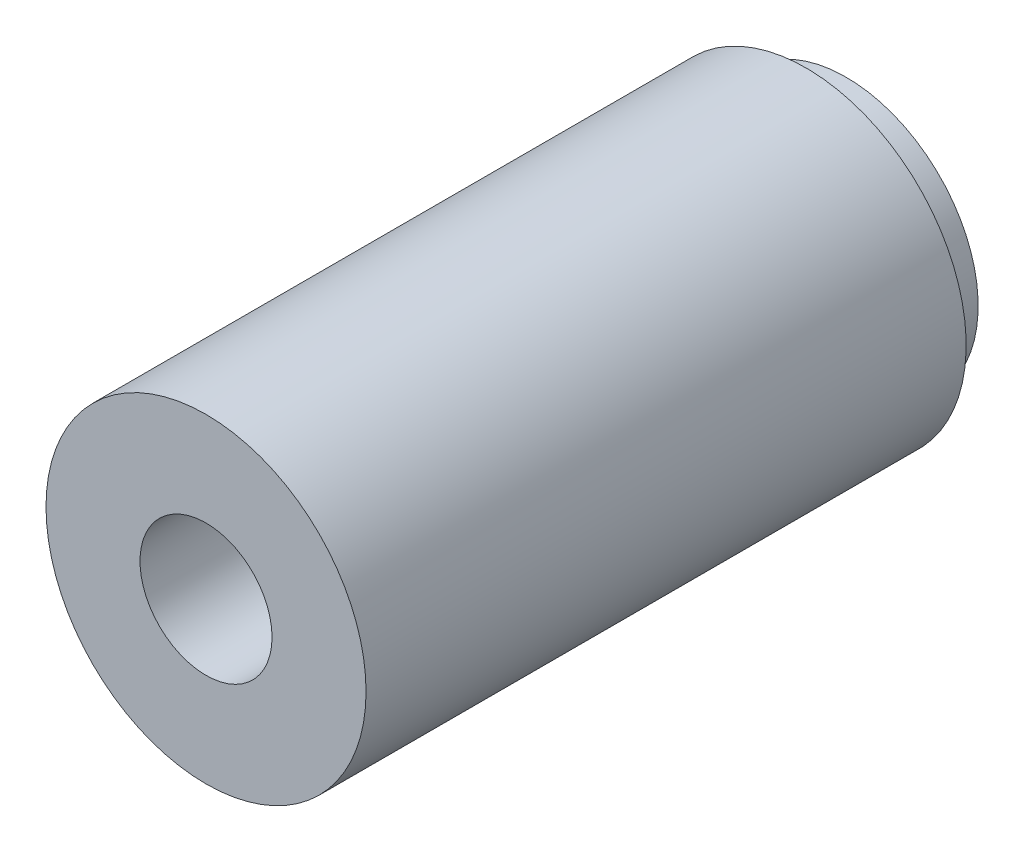
ISO-10303-21;
HEADER;
FILE_DESCRIPTION(('STEP AP214'),'2;1');
FILE_NAME('part.step','',(''),(''),'','','');
FILE_SCHEMA(('AUTOMOTIVE_DESIGN { 1 0 10303 214 1 1 1 1 }'));
ENDSEC;
DATA;
#1=APPLICATION_CONTEXT('core data for automotive mechanical design processes');
#2=APPLICATION_PROTOCOL_DEFINITION('international standard','automotive_design',2000,#1);
#3=PRODUCT_CONTEXT('',#1,'mechanical');
#4=PRODUCT('Part','Part','',(#3));
#5=PRODUCT_RELATED_PRODUCT_CATEGORY('part','',(#4));
#6=PRODUCT_DEFINITION_FORMATION('','',#4);
#7=PRODUCT_DEFINITION_CONTEXT('part definition',#1,'design');
#8=PRODUCT_DEFINITION('design','',#6,#7);
#9=PRODUCT_DEFINITION_SHAPE('','',#8);
#10=(LENGTH_UNIT() NAMED_UNIT(*) SI_UNIT(.MILLI.,.METRE.));
#11=(NAMED_UNIT(*) PLANE_ANGLE_UNIT() SI_UNIT($,.RADIAN.));
#12=(NAMED_UNIT(*) SI_UNIT($,.STERADIAN.) SOLID_ANGLE_UNIT());
#13=UNCERTAINTY_MEASURE_WITH_UNIT(LENGTH_MEASURE(1.E-05),#10,'distance_accuracy_value','');
#14=(GEOMETRIC_REPRESENTATION_CONTEXT(3) GLOBAL_UNCERTAINTY_ASSIGNED_CONTEXT((#13)) GLOBAL_UNIT_ASSIGNED_CONTEXT((#10,
#11,#12)) REPRESENTATION_CONTEXT('',''));
#15=CARTESIAN_POINT('',(0.,0.,0.));
#16=DIRECTION('',(0.,0.,1.));
#17=DIRECTION('',(1.,0.,0.));
#18=AXIS2_PLACEMENT_3D('',#15,#16,#17);
#19=CARTESIAN_POINT('',(0.,0.,16.));
#20=DIRECTION('',(0.,0.,-1.));
#21=DIRECTION('',(-1.,0.,0.));
#22=AXIS2_PLACEMENT_3D('',#19,#20,#21);
#23=CYLINDRICAL_SURFACE('',#22,4.);
#24=CARTESIAN_POINT('',(0.,0.,16.));
#25=DIRECTION('',(0.,0.,1.));
#26=DIRECTION('',(1.,0.,0.));
#27=AXIS2_PLACEMENT_3D('',#24,#25,#26);
#28=CIRCLE('',#27,4.);
#29=CARTESIAN_POINT('',(4.,0.,16.));
#30=VERTEX_POINT('',#29);
#31=EDGE_CURVE('E11',#30,#30,#28,.T.);
#32=ORIENTED_EDGE('',*,*,#31,.F.);
#33=EDGE_LOOP('',(#32));
#34=FACE_BOUND('',#33,.T.);
#35=CARTESIAN_POINT('',(0.,0.,1.));
#36=DIRECTION('',(0.,0.,-1.));
#37=DIRECTION('',(-1.,0.,0.));
#38=AXIS2_PLACEMENT_3D('',#35,#36,#37);
#39=CIRCLE('',#38,4.);
#40=CARTESIAN_POINT('',(-4.,0.,1.));
#41=VERTEX_POINT('',#40);
#42=EDGE_CURVE('E41',#41,#41,#39,.T.);
#43=ORIENTED_EDGE('',*,*,#42,.F.);
#44=EDGE_LOOP('',(#43));
#45=FACE_BOUND('',#44,.T.);
#46=ADVANCED_FACE('F38',(#34,#45),#23,.T.);
#47=CARTESIAN_POINT('',(0.,0.,0.));
#48=DIRECTION('',(0.,0.,1.));
#49=DIRECTION('',(1.,0.,0.));
#50=AXIS2_PLACEMENT_3D('',#47,#48,#49);
#51=PLANE('',#50);
#52=CARTESIAN_POINT('',(0.,0.,0.));
#53=DIRECTION('',(0.,0.,-1.));
#54=DIRECTION('',(-1.,0.,0.));
#55=AXIS2_PLACEMENT_3D('',#52,#53,#54);
#56=CIRCLE('',#55,2.5);
#57=CARTESIAN_POINT('',(-2.5,0.,0.));
#58=VERTEX_POINT('',#57);
#59=EDGE_CURVE('E55',#58,#58,#56,.T.);
#60=ORIENTED_EDGE('',*,*,#59,.F.);
#61=EDGE_LOOP('',(#60));
#62=FACE_BOUND('',#61,.T.);
#63=CARTESIAN_POINT('',(0.,0.,0.));
#64=DIRECTION('',(0.,0.,-1.));
#65=DIRECTION('',(-1.,0.,0.));
#66=AXIS2_PLACEMENT_3D('',#63,#64,#65);
#67=CIRCLE('',#66,3.3);
#68=CARTESIAN_POINT('',(-3.3,0.,0.));
#69=VERTEX_POINT('',#68);
#70=EDGE_CURVE('E60',#69,#69,#67,.T.);
#71=ORIENTED_EDGE('',*,*,#70,.T.);
#72=EDGE_LOOP('',(#71));
#73=FACE_BOUND('',#72,.T.);
#74=ADVANCED_FACE('F73',(#62,#73),#51,.F.);
#75=CARTESIAN_POINT('',(0.,0.,16.));
#76=DIRECTION('',(0.,0.,1.));
#77=DIRECTION('',(1.,0.,0.));
#78=AXIS2_PLACEMENT_3D('',#75,#76,#77);
#79=PLANE('',#78);
#80=CARTESIAN_POINT('',(0.,0.,16.));
#81=DIRECTION('',(0.,0.,1.));
#82=DIRECTION('',(1.,0.,0.));
#83=AXIS2_PLACEMENT_3D('',#80,#81,#82);
#84=CIRCLE('',#83,1.64999999999999);
#85=CARTESIAN_POINT('',(1.64999999999999,0.,16.));
#86=VERTEX_POINT('',#85);
#87=EDGE_CURVE('E45',#86,#86,#84,.T.);
#88=ORIENTED_EDGE('',*,*,#87,.F.);
#89=EDGE_LOOP('',(#88));
#90=FACE_BOUND('',#89,.T.);
#91=ORIENTED_EDGE('',*,*,#31,.T.);
#92=EDGE_LOOP('',(#91));
#93=FACE_BOUND('',#92,.T.);
#94=ADVANCED_FACE('F78',(#90,#93),#79,.T.);
#95=CARTESIAN_POINT('',(0.,0.,16.));
#96=DIRECTION('',(0.,0.,1.));
#97=DIRECTION('',(1.,0.,0.));
#98=AXIS2_PLACEMENT_3D('',#95,#96,#97);
#99=CYLINDRICAL_SURFACE('',#98,1.64999999999999);
#100=CARTESIAN_POINT('',(0.,0.,8.));
#101=DIRECTION('',(0.,0.,-1.));
#102=DIRECTION('',(-1.,0.,0.));
#103=AXIS2_PLACEMENT_3D('',#100,#101,#102);
#104=CIRCLE('',#103,1.64999999999999);
#105=CARTESIAN_POINT('',(-1.64999999999999,0.,8.));
#106=VERTEX_POINT('',#105);
#107=EDGE_CURVE('E49',#106,#106,#104,.F.);
#108=ORIENTED_EDGE('',*,*,#107,.F.);
#109=EDGE_LOOP('',(#108));
#110=FACE_BOUND('',#109,.T.);
#111=ORIENTED_EDGE('',*,*,#87,.T.);
#112=EDGE_LOOP('',(#111));
#113=FACE_BOUND('',#112,.T.);
#114=ADVANCED_FACE('F83',(#110,#113),#99,.F.);
#115=CARTESIAN_POINT('',(0.,0.,8.));
#116=DIRECTION('',(0.,0.,-1.));
#117=DIRECTION('',(-1.,0.,0.));
#118=AXIS2_PLACEMENT_3D('',#115,#116,#117);
#119=PLANE('',#118);
#120=CARTESIAN_POINT('',(0.,0.,8.));
#121=DIRECTION('',(0.,0.,-1.));
#122=DIRECTION('',(-1.,0.,0.));
#123=AXIS2_PLACEMENT_3D('',#120,#121,#122);
#124=CIRCLE('',#123,2.5);
#125=CARTESIAN_POINT('',(-2.5,0.,8.));
#126=VERTEX_POINT('',#125);
#127=EDGE_CURVE('E54',#126,#126,#124,.T.);
#128=ORIENTED_EDGE('',*,*,#127,.T.);
#129=EDGE_LOOP('',(#128));
#130=FACE_BOUND('',#129,.T.);
#131=ORIENTED_EDGE('',*,*,#107,.T.);
#132=EDGE_LOOP('',(#131));
#133=FACE_BOUND('',#132,.T.);
#134=ADVANCED_FACE('F91',(#130,#133),#119,.T.);
#135=CARTESIAN_POINT('',(0.,0.,8.));
#136=DIRECTION('',(0.,0.,-1.));
#137=DIRECTION('',(-1.,0.,0.));
#138=AXIS2_PLACEMENT_3D('',#135,#136,#137);
#139=CYLINDRICAL_SURFACE('',#138,2.5);
#140=ORIENTED_EDGE('',*,*,#127,.F.);
#141=EDGE_LOOP('',(#140));
#142=FACE_BOUND('',#141,.T.);
#143=ORIENTED_EDGE('',*,*,#59,.T.);
#144=EDGE_LOOP('',(#143));
#145=FACE_BOUND('',#144,.T.);
#146=ADVANCED_FACE('F93',(#142,#145),#139,.F.);
#147=CARTESIAN_POINT('',(0.,0.,1.));
#148=DIRECTION('',(0.,0.,-1.));
#149=DIRECTION('',(-1.,0.,0.));
#150=AXIS2_PLACEMENT_3D('',#147,#148,#149);
#151=PLANE('',#150);
#152=CARTESIAN_POINT('',(0.,0.,1.));
#153=DIRECTION('',(0.,0.,-1.));
#154=DIRECTION('',(-1.,0.,0.));
#155=AXIS2_PLACEMENT_3D('',#152,#153,#154);
#156=CIRCLE('',#155,3.3);
#157=CARTESIAN_POINT('',(-3.3,0.,1.));
#158=VERTEX_POINT('',#157);
#159=EDGE_CURVE('E63',#158,#158,#156,.T.);
#160=ORIENTED_EDGE('',*,*,#159,.F.);
#161=EDGE_LOOP('',(#160));
#162=FACE_BOUND('',#161,.T.);
#163=ORIENTED_EDGE('',*,*,#42,.T.);
#164=EDGE_LOOP('',(#163));
#165=FACE_BOUND('',#164,.T.);
#166=ADVANCED_FACE('F70',(#162,#165),#151,.T.);
#167=CARTESIAN_POINT('',(0.,0.,1.));
#168=DIRECTION('',(0.,0.,-1.));
#169=DIRECTION('',(-1.,0.,0.));
#170=AXIS2_PLACEMENT_3D('',#167,#168,#169);
#171=CYLINDRICAL_SURFACE('',#170,3.3);
#172=ORIENTED_EDGE('',*,*,#159,.T.);
#173=EDGE_LOOP('',(#172));
#174=FACE_BOUND('',#173,.T.);
#175=ORIENTED_EDGE('',*,*,#70,.F.);
#176=EDGE_LOOP('',(#175));
#177=FACE_BOUND('',#176,.T.);
#178=ADVANCED_FACE('F102',(#174,#177),#171,.T.);
#179=CLOSED_SHELL('',(#46,#74,#94,#114,#134,#146,#166,#178));
#180=MANIFOLD_SOLID_BREP('B2',#179);
#181=ADVANCED_BREP_SHAPE_REPRESENTATION('',(#18,#180),#14);
#182=SHAPE_DEFINITION_REPRESENTATION(#9,#181);
ENDSEC;
END-ISO-10303-21;
